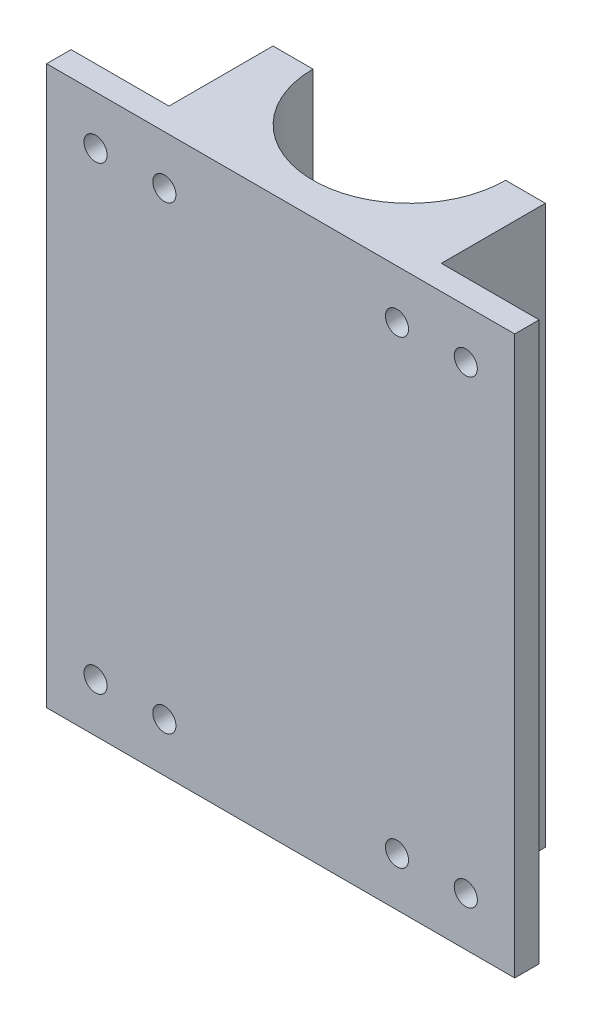
ISO-10303-21;
HEADER;
FILE_DESCRIPTION(('STEP AP214'),'2;1');
FILE_NAME('part.step','',(''),(''),'','','');
FILE_SCHEMA(('AUTOMOTIVE_DESIGN { 1 0 10303 214 1 1 1 1 }'));
ENDSEC;
DATA;
#1=APPLICATION_CONTEXT('core data for automotive mechanical design processes');
#2=APPLICATION_PROTOCOL_DEFINITION('international standard','automotive_design',2000,#1);
#3=PRODUCT_CONTEXT('',#1,'mechanical');
#4=PRODUCT('Part','Part','',(#3));
#5=PRODUCT_RELATED_PRODUCT_CATEGORY('part','',(#4));
#6=PRODUCT_DEFINITION_FORMATION('','',#4);
#7=PRODUCT_DEFINITION_CONTEXT('part definition',#1,'design');
#8=PRODUCT_DEFINITION('design','',#6,#7);
#9=PRODUCT_DEFINITION_SHAPE('','',#8);
#10=(LENGTH_UNIT() NAMED_UNIT(*) SI_UNIT(.MILLI.,.METRE.));
#11=(NAMED_UNIT(*) PLANE_ANGLE_UNIT() SI_UNIT($,.RADIAN.));
#12=(NAMED_UNIT(*) SI_UNIT($,.STERADIAN.) SOLID_ANGLE_UNIT());
#13=UNCERTAINTY_MEASURE_WITH_UNIT(LENGTH_MEASURE(1.E-05),#10,'distance_accuracy_value','');
#14=(GEOMETRIC_REPRESENTATION_CONTEXT(3) GLOBAL_UNCERTAINTY_ASSIGNED_CONTEXT((#13)) GLOBAL_UNIT_ASSIGNED_CONTEXT((#10,
#11,#12)) REPRESENTATION_CONTEXT('',''));
#15=CARTESIAN_POINT('',(0.,0.,0.));
#16=DIRECTION('',(0.,0.,1.));
#17=DIRECTION('',(1.,0.,0.));
#18=AXIS2_PLACEMENT_3D('',#15,#16,#17);
#19=CARTESIAN_POINT('',(0.,72.39,-17.6981702709716));
#20=DIRECTION('',(0.,0.,-1.));
#21=DIRECTION('',(-1.,0.,0.));
#22=AXIS2_PLACEMENT_3D('',#19,#20,#21);
#23=PLANE('',#22);
#24=CARTESIAN_POINT('',(30.5533116,66.04,-17.6981702709716));
#25=DIRECTION('',(0.,0.,-1.));
#26=DIRECTION('',(-1.,0.,0.));
#27=AXIS2_PLACEMENT_3D('',#24,#25,#26);
#28=CIRCLE('',#27,1.5);
#29=CARTESIAN_POINT('',(29.0533116,66.04,-17.6981702709716));
#30=VERTEX_POINT('',#29);
#31=EDGE_CURVE('E188',#30,#30,#28,.T.);
#32=ORIENTED_EDGE('',*,*,#31,.F.);
#33=EDGE_LOOP('',(#32));
#34=FACE_BOUND('',#33,.T.);
#35=CARTESIAN_POINT('',(30.5533116,6.35,-17.6981702709716));
#36=DIRECTION('',(0.,0.,-1.));
#37=DIRECTION('',(-1.,0.,0.));
#38=AXIS2_PLACEMENT_3D('',#35,#36,#37);
#39=CIRCLE('',#38,1.5);
#40=CARTESIAN_POINT('',(29.0533116,6.35,-17.6981702709716));
#41=VERTEX_POINT('',#40);
#42=EDGE_CURVE('E184',#41,#41,#39,.T.);
#43=ORIENTED_EDGE('',*,*,#42,.F.);
#44=EDGE_LOOP('',(#43));
#45=FACE_BOUND('',#44,.T.);
#46=DIRECTION('',(1.,0.,0.));
#47=VECTOR('',#46,1.);
#48=CARTESIAN_POINT('',(0.,0.,-17.6981702709716));
#49=LINE('',#48,#47);
#50=CARTESIAN_POINT('',(24.2033116,0.,-17.6981702709716));
#51=VERTEX_POINT('',#50);
#52=CARTESIAN_POINT('',(36.9033116,0.,-17.6981702709716));
#53=VERTEX_POINT('',#52);
#54=EDGE_CURVE('E137',#51,#53,#49,.T.);
#55=ORIENTED_EDGE('',*,*,#54,.F.);
#56=DIRECTION('',(0.,-1.,0.));
#57=VECTOR('',#56,1.);
#58=CARTESIAN_POINT('',(24.2033116,72.39,-17.6981702709716));
#59=LINE('',#58,#57);
#60=CARTESIAN_POINT('',(24.2033116,72.39,-17.6981702709716));
#61=VERTEX_POINT('',#60);
#62=EDGE_CURVE('E11',#61,#51,#59,.T.);
#63=ORIENTED_EDGE('',*,*,#62,.F.);
#64=DIRECTION('',(1.,0.,0.));
#65=VECTOR('',#64,1.);
#66=CARTESIAN_POINT('',(0.,72.39,-17.6981702709716));
#67=LINE('',#66,#65);
#68=CARTESIAN_POINT('',(36.9033116,72.39,-17.6981702709716));
#69=VERTEX_POINT('',#68);
#70=EDGE_CURVE('E160',#61,#69,#67,.T.);
#71=ORIENTED_EDGE('',*,*,#70,.T.);
#72=DIRECTION('',(0.,-1.,0.));
#73=VECTOR('',#72,1.);
#74=CARTESIAN_POINT('',(36.9033116,72.39,-17.6981702709716));
#75=LINE('',#74,#73);
#76=EDGE_CURVE('E51',#69,#53,#75,.T.);
#77=ORIENTED_EDGE('',*,*,#76,.T.);
#78=EDGE_LOOP('',(#55,#63,#71,#77));
#79=FACE_BOUND('',#78,.T.);
#80=ADVANCED_FACE('F33',(#34,#45,#79),#23,.T.);
#81=CARTESIAN_POINT('',(24.2033116,72.39,0.));
#82=DIRECTION('',(1.,0.,0.));
#83=DIRECTION('',(0.,0.,-1.));
#84=AXIS2_PLACEMENT_3D('',#81,#82,#83);
#85=PLANE('',#84);
#86=DIRECTION('',(0.,0.,1.));
#87=VECTOR('',#86,1.);
#88=CARTESIAN_POINT('',(24.2033116,0.,0.));
#89=LINE('',#88,#87);
#90=CARTESIAN_POINT('',(24.2033116,0.,-31.2047756606383));
#91=VERTEX_POINT('',#90);
#92=EDGE_CURVE('E139',#91,#51,#89,.T.);
#93=ORIENTED_EDGE('',*,*,#92,.F.);
#94=DIRECTION('',(0.,-1.,0.));
#95=VECTOR('',#94,1.);
#96=CARTESIAN_POINT('',(24.2033116,72.39,-31.2047756606383));
#97=LINE('',#96,#95);
#98=CARTESIAN_POINT('',(24.2033116,72.39,-31.2047756606383));
#99=VERTEX_POINT('',#98);
#100=EDGE_CURVE('E42',#99,#91,#97,.T.);
#101=ORIENTED_EDGE('',*,*,#100,.F.);
#102=DIRECTION('',(0.,0.,1.));
#103=VECTOR('',#102,1.);
#104=CARTESIAN_POINT('',(24.2033116,72.39,0.));
#105=LINE('',#104,#103);
#106=EDGE_CURVE('E240',#99,#61,#105,.T.);
#107=ORIENTED_EDGE('',*,*,#106,.T.);
#108=ORIENTED_EDGE('',*,*,#62,.T.);
#109=EDGE_LOOP('',(#93,#101,#107,#108));
#110=FACE_BOUND('',#109,.T.);
#111=ADVANCED_FACE('F270',(#110),#85,.T.);
#112=CARTESIAN_POINT('',(0.,72.39,-31.2047756606383));
#113=DIRECTION('',(0.,0.,1.));
#114=DIRECTION('',(1.,0.,0.));
#115=AXIS2_PLACEMENT_3D('',#112,#113,#114);
#116=PLANE('',#115);
#117=CARTESIAN_POINT('',(21.6233116,66.04,-31.2047756606383));
#118=DIRECTION('',(0.,0.,-1.));
#119=DIRECTION('',(-1.,0.,0.));
#120=AXIS2_PLACEMENT_3D('',#117,#118,#119);
#121=CIRCLE('',#120,1.5);
#122=CARTESIAN_POINT('',(20.1233116,66.04,-31.2047756606383));
#123=VERTEX_POINT('',#122);
#124=EDGE_CURVE('E470',#123,#123,#121,.T.);
#125=ORIENTED_EDGE('',*,*,#124,.F.);
#126=EDGE_LOOP('',(#125));
#127=FACE_BOUND('',#126,.T.);
#128=CARTESIAN_POINT('',(21.6233116,6.35,-31.2047756606383));
#129=DIRECTION('',(0.,0.,-1.));
#130=DIRECTION('',(-1.,0.,0.));
#131=AXIS2_PLACEMENT_3D('',#128,#129,#130);
#132=CIRCLE('',#131,1.5);
#133=CARTESIAN_POINT('',(20.1233116,6.35,-31.2047756606383));
#134=VERTEX_POINT('',#133);
#135=EDGE_CURVE('E204',#134,#134,#132,.T.);
#136=ORIENTED_EDGE('',*,*,#135,.F.);
#137=EDGE_LOOP('',(#136));
#138=FACE_BOUND('',#137,.T.);
#139=DIRECTION('',(-1.,0.,0.));
#140=VECTOR('',#139,1.);
#141=CARTESIAN_POINT('',(0.,0.,-31.2047756606383));
#142=LINE('',#141,#140);
#143=CARTESIAN_POINT('',(18.741964554409,0.,-31.2047756606383));
#144=VERTEX_POINT('',#143);
#145=EDGE_CURVE('E143',#91,#144,#142,.T.);
#146=ORIENTED_EDGE('',*,*,#145,.T.);
#147=DIRECTION('',(0.,-1.,0.));
#148=VECTOR('',#147,1.);
#149=CARTESIAN_POINT('',(18.741964554409,51.39,-31.2047756606383));
#150=LINE('',#149,#148);
#151=CARTESIAN_POINT('',(18.741964554409,51.39,-31.2047756606383));
#152=VERTEX_POINT('',#151);
#153=EDGE_CURVE('E140',#152,#144,#150,.T.);
#154=ORIENTED_EDGE('',*,*,#153,.F.);
#155=DIRECTION('',(-1.,0.,0.));
#156=VECTOR('',#155,1.);
#157=CARTESIAN_POINT('',(19.041964554409,51.39,-31.2047756606383));
#158=LINE('',#157,#156);
#159=CARTESIAN_POINT('',(19.041964554409,51.39,-31.2047756606383));
#160=VERTEX_POINT('',#159);
#161=EDGE_CURVE('E226',#160,#152,#158,.T.);
#162=ORIENTED_EDGE('',*,*,#161,.F.);
#163=DIRECTION('',(0.,-1.,0.));
#164=VECTOR('',#163,1.);
#165=CARTESIAN_POINT('',(19.041964554409,72.39,-31.2047756606383));
#166=LINE('',#165,#164);
#167=CARTESIAN_POINT('',(19.041964554409,72.39,-31.2047756606383));
#168=VERTEX_POINT('',#167);
#169=EDGE_CURVE('E172',#168,#160,#166,.T.);
#170=ORIENTED_EDGE('',*,*,#169,.F.);
#171=DIRECTION('',(-1.,0.,0.));
#172=VECTOR('',#171,1.);
#173=CARTESIAN_POINT('',(0.,72.39,-31.2047756606383));
#174=LINE('',#173,#172);
#175=EDGE_CURVE('E243',#99,#168,#174,.T.);
#176=ORIENTED_EDGE('',*,*,#175,.F.);
#177=ORIENTED_EDGE('',*,*,#100,.T.);
#178=EDGE_LOOP('',(#146,#154,#162,#170,#176,#177));
#179=FACE_BOUND('',#178,.T.);
#180=ADVANCED_FACE('F275',(#127,#138,#179),#116,.F.);
#181=CARTESIAN_POINT('',(6.54196455440903,72.39,-31.2047756606383));
#182=DIRECTION('',(0.,-1.,0.));
#183=DIRECTION('',(0.,0.,-1.));
#184=AXIS2_PLACEMENT_3D('',#181,#182,#183);
#185=CYLINDRICAL_SURFACE('',#184,12.5);
#186=CARTESIAN_POINT('',(6.54196455440903,51.39,-31.2047756606383));
#187=DIRECTION('',(0.,1.,0.));
#188=DIRECTION('',(0.,0.,1.));
#189=AXIS2_PLACEMENT_3D('',#186,#187,#188);
#190=CIRCLE('',#189,12.5);
#191=CARTESIAN_POINT('',(-5.95803544559097,51.39,-31.2047756606383));
#192=VERTEX_POINT('',#191);
#193=EDGE_CURVE('E229',#192,#160,#190,.T.);
#194=ORIENTED_EDGE('',*,*,#193,.F.);
#195=DIRECTION('',(0.,-1.,0.));
#196=VECTOR('',#195,1.);
#197=CARTESIAN_POINT('',(-5.95803544559097,72.39,-31.2047756606383));
#198=LINE('',#197,#196);
#199=CARTESIAN_POINT('',(-5.95803544559097,72.39,-31.2047756606383));
#200=VERTEX_POINT('',#199);
#201=EDGE_CURVE('E169',#200,#192,#198,.T.);
#202=ORIENTED_EDGE('',*,*,#201,.F.);
#203=CARTESIAN_POINT('',(6.54196455440903,72.39,-31.2047756606383));
#204=DIRECTION('',(0.,1.,0.));
#205=DIRECTION('',(0.,0.,1.));
#206=AXIS2_PLACEMENT_3D('',#203,#204,#205);
#207=CIRCLE('',#206,12.5);
#208=EDGE_CURVE('E245',#200,#168,#207,.T.);
#209=ORIENTED_EDGE('',*,*,#208,.T.);
#210=ORIENTED_EDGE('',*,*,#169,.T.);
#211=EDGE_LOOP('',(#194,#202,#209,#210));
#212=FACE_BOUND('',#211,.T.);
#213=ADVANCED_FACE('F292',(#212),#185,.F.);
#214=CARTESIAN_POINT('',(0.,72.39,-31.2047756606383));
#215=DIRECTION('',(0.,0.,1.));
#216=DIRECTION('',(1.,0.,0.));
#217=AXIS2_PLACEMENT_3D('',#214,#215,#216);
#218=PLANE('',#217);
#219=CARTESIAN_POINT('',(-8.5666884,6.35,-31.2047756606383));
#220=DIRECTION('',(0.,0.,-1.));
#221=DIRECTION('',(-1.,0.,0.));
#222=AXIS2_PLACEMENT_3D('',#219,#220,#221);
#223=CIRCLE('',#222,1.5);
#224=CARTESIAN_POINT('',(-10.0666884,6.35,-31.2047756606383));
#225=VERTEX_POINT('',#224);
#226=EDGE_CURVE('E194',#225,#225,#223,.T.);
#227=ORIENTED_EDGE('',*,*,#226,.F.);
#228=EDGE_LOOP('',(#227));
#229=FACE_BOUND('',#228,.T.);
#230=CARTESIAN_POINT('',(-8.5666884,66.04,-31.2047756606383));
#231=DIRECTION('',(0.,0.,-1.));
#232=DIRECTION('',(-1.,0.,0.));
#233=AXIS2_PLACEMENT_3D('',#230,#231,#232);
#234=CIRCLE('',#233,1.5);
#235=CARTESIAN_POINT('',(-10.0666884,66.04,-31.2047756606383));
#236=VERTEX_POINT('',#235);
#237=EDGE_CURVE('E191',#236,#236,#234,.T.);
#238=ORIENTED_EDGE('',*,*,#237,.F.);
#239=EDGE_LOOP('',(#238));
#240=FACE_BOUND('',#239,.T.);
#241=DIRECTION('',(-1.,0.,0.));
#242=VECTOR('',#241,1.);
#243=CARTESIAN_POINT('',(0.,0.,-31.2047756606383));
#244=LINE('',#243,#242);
#245=CARTESIAN_POINT('',(-5.65803544559097,0.,-31.2047756606383));
#246=VERTEX_POINT('',#245);
#247=CARTESIAN_POINT('',(-11.1466884,0.,-31.2047756606383));
#248=VERTEX_POINT('',#247);
#249=EDGE_CURVE('E146',#246,#248,#244,.T.);
#250=ORIENTED_EDGE('',*,*,#249,.T.);
#251=DIRECTION('',(0.,-1.,0.));
#252=VECTOR('',#251,1.);
#253=CARTESIAN_POINT('',(-11.1466884,72.39,-31.2047756606383));
#254=LINE('',#253,#252);
#255=CARTESIAN_POINT('',(-11.1466884,72.39,-31.2047756606383));
#256=VERTEX_POINT('',#255);
#257=EDGE_CURVE('E166',#256,#248,#254,.T.);
#258=ORIENTED_EDGE('',*,*,#257,.F.);
#259=DIRECTION('',(-1.,0.,0.));
#260=VECTOR('',#259,1.);
#261=CARTESIAN_POINT('',(0.,72.39,-31.2047756606383));
#262=LINE('',#261,#260);
#263=EDGE_CURVE('E248',#200,#256,#262,.T.);
#264=ORIENTED_EDGE('',*,*,#263,.F.);
#265=ORIENTED_EDGE('',*,*,#201,.T.);
#266=DIRECTION('',(1.,0.,0.));
#267=VECTOR('',#266,1.);
#268=CARTESIAN_POINT('',(-5.95803544559097,51.39,-31.2047756606383));
#269=LINE('',#268,#267);
#270=CARTESIAN_POINT('',(-5.65803544559097,51.39,-31.2047756606383));
#271=VERTEX_POINT('',#270);
#272=EDGE_CURVE('E220',#192,#271,#269,.T.);
#273=ORIENTED_EDGE('',*,*,#272,.T.);
#274=DIRECTION('',(0.,-1.,0.));
#275=VECTOR('',#274,1.);
#276=CARTESIAN_POINT('',(-5.65803544559097,51.39,-31.2047756606383));
#277=LINE('',#276,#275);
#278=EDGE_CURVE('E232',#271,#246,#277,.T.);
#279=ORIENTED_EDGE('',*,*,#278,.T.);
#280=EDGE_LOOP('',(#250,#258,#264,#265,#273,#279));
#281=FACE_BOUND('',#280,.T.);
#282=ADVANCED_FACE('F296',(#229,#240,#281),#218,.F.);
#283=CARTESIAN_POINT('',(-11.1466884,72.39,0.));
#284=DIRECTION('',(1.,0.,0.));
#285=DIRECTION('',(0.,0.,-1.));
#286=AXIS2_PLACEMENT_3D('',#283,#284,#285);
#287=PLANE('',#286);
#288=DIRECTION('',(0.,0.,1.));
#289=VECTOR('',#288,1.);
#290=CARTESIAN_POINT('',(-11.1466884,0.,0.));
#291=LINE('',#290,#289);
#292=CARTESIAN_POINT('',(-11.1466884,0.,-17.6981702709716));
#293=VERTEX_POINT('',#292);
#294=EDGE_CURVE('E148',#248,#293,#291,.T.);
#295=ORIENTED_EDGE('',*,*,#294,.T.);
#296=DIRECTION('',(0.,-1.,0.));
#297=VECTOR('',#296,1.);
#298=CARTESIAN_POINT('',(-11.1466884,72.39,-17.6981702709716));
#299=LINE('',#298,#297);
#300=CARTESIAN_POINT('',(-11.1466884,72.39,-17.6981702709716));
#301=VERTEX_POINT('',#300);
#302=EDGE_CURVE('E164',#301,#293,#299,.T.);
#303=ORIENTED_EDGE('',*,*,#302,.F.);
#304=DIRECTION('',(0.,0.,1.));
#305=VECTOR('',#304,1.);
#306=CARTESIAN_POINT('',(-11.1466884,72.39,0.));
#307=LINE('',#306,#305);
#308=EDGE_CURVE('E250',#256,#301,#307,.T.);
#309=ORIENTED_EDGE('',*,*,#308,.F.);
#310=ORIENTED_EDGE('',*,*,#257,.T.);
#311=EDGE_LOOP('',(#295,#303,#309,#310));
#312=FACE_BOUND('',#311,.T.);
#313=ADVANCED_FACE('F299',(#312),#287,.F.);
#314=CARTESIAN_POINT('',(0.,72.39,-17.6981702709716));
#315=DIRECTION('',(0.,0.,-1.));
#316=DIRECTION('',(-1.,0.,0.));
#317=AXIS2_PLACEMENT_3D('',#314,#315,#316);
#318=PLANE('',#317);
#319=CARTESIAN_POINT('',(-17.4985284,6.35,-17.6981702709716));
#320=DIRECTION('',(0.,0.,-1.));
#321=DIRECTION('',(-1.,0.,0.));
#322=AXIS2_PLACEMENT_3D('',#319,#320,#321);
#323=CIRCLE('',#322,1.5);
#324=CARTESIAN_POINT('',(-18.9985284,6.35,-17.6981702709716));
#325=VERTEX_POINT('',#324);
#326=EDGE_CURVE('E180',#325,#325,#323,.T.);
#327=ORIENTED_EDGE('',*,*,#326,.F.);
#328=EDGE_LOOP('',(#327));
#329=FACE_BOUND('',#328,.T.);
#330=CARTESIAN_POINT('',(-17.4985284,66.04,-17.6981702709716));
#331=DIRECTION('',(0.,0.,-1.));
#332=DIRECTION('',(-1.,0.,0.));
#333=AXIS2_PLACEMENT_3D('',#330,#331,#332);
#334=CIRCLE('',#333,1.5);
#335=CARTESIAN_POINT('',(-18.9985284,66.04,-17.6981702709716));
#336=VERTEX_POINT('',#335);
#337=EDGE_CURVE('E179',#336,#336,#334,.T.);
#338=ORIENTED_EDGE('',*,*,#337,.F.);
#339=EDGE_LOOP('',(#338));
#340=FACE_BOUND('',#339,.T.);
#341=DIRECTION('',(1.,0.,0.));
#342=VECTOR('',#341,1.);
#343=CARTESIAN_POINT('',(0.,0.,-17.6981702709716));
#344=LINE('',#343,#342);
#345=CARTESIAN_POINT('',(-23.8485284,0.,-17.6981702709716));
#346=VERTEX_POINT('',#345);
#347=EDGE_CURVE('E151',#346,#293,#344,.T.);
#348=ORIENTED_EDGE('',*,*,#347,.F.);
#349=DIRECTION('',(0.,-1.,0.));
#350=VECTOR('',#349,1.);
#351=CARTESIAN_POINT('',(-23.8485284,72.39,-17.6981702709716));
#352=LINE('',#351,#350);
#353=CARTESIAN_POINT('',(-23.8485284,72.39,-17.6981702709716));
#354=VERTEX_POINT('',#353);
#355=EDGE_CURVE('E129',#354,#346,#352,.T.);
#356=ORIENTED_EDGE('',*,*,#355,.F.);
#357=DIRECTION('',(1.,0.,0.));
#358=VECTOR('',#357,1.);
#359=CARTESIAN_POINT('',(0.,72.39,-17.6981702709716));
#360=LINE('',#359,#358);
#361=EDGE_CURVE('E119',#354,#301,#360,.T.);
#362=ORIENTED_EDGE('',*,*,#361,.T.);
#363=ORIENTED_EDGE('',*,*,#302,.T.);
#364=EDGE_LOOP('',(#348,#356,#362,#363));
#365=FACE_BOUND('',#364,.T.);
#366=ADVANCED_FACE('F253',(#329,#340,#365),#318,.T.);
#367=CARTESIAN_POINT('',(-23.8485284,72.39,0.));
#368=DIRECTION('',(1.,0.,0.));
#369=DIRECTION('',(0.,0.,-1.));
#370=AXIS2_PLACEMENT_3D('',#367,#368,#369);
#371=PLANE('',#370);
#372=DIRECTION('',(0.,0.,1.));
#373=VECTOR('',#372,1.);
#374=CARTESIAN_POINT('',(-23.8485284,0.,0.));
#375=LINE('',#374,#373);
#376=CARTESIAN_POINT('',(-23.8485284,0.,-14.5231702709716));
#377=VERTEX_POINT('',#376);
#378=EDGE_CURVE('E126',#346,#377,#375,.T.);
#379=ORIENTED_EDGE('',*,*,#378,.T.);
#380=DIRECTION('',(0.,-1.,0.));
#381=VECTOR('',#380,1.);
#382=CARTESIAN_POINT('',(-23.8485284,72.39,-14.5231702709716));
#383=LINE('',#382,#381);
#384=CARTESIAN_POINT('',(-23.8485284,72.39,-14.5231702709716));
#385=VERTEX_POINT('',#384);
#386=EDGE_CURVE('E123',#385,#377,#383,.T.);
#387=ORIENTED_EDGE('',*,*,#386,.F.);
#388=DIRECTION('',(0.,0.,1.));
#389=VECTOR('',#388,1.);
#390=CARTESIAN_POINT('',(-23.8485284,72.39,0.));
#391=LINE('',#390,#389);
#392=EDGE_CURVE('E112',#354,#385,#391,.T.);
#393=ORIENTED_EDGE('',*,*,#392,.F.);
#394=ORIENTED_EDGE('',*,*,#355,.T.);
#395=EDGE_LOOP('',(#379,#387,#393,#394));
#396=FACE_BOUND('',#395,.T.);
#397=ADVANCED_FACE('F124',(#396),#371,.F.);
#398=CARTESIAN_POINT('',(0.,72.39,-14.5231702709716));
#399=DIRECTION('',(0.,0.,-1.));
#400=DIRECTION('',(-1.,0.,0.));
#401=AXIS2_PLACEMENT_3D('',#398,#399,#400);
#402=PLANE('',#401);
#403=CARTESIAN_POINT('',(21.6233116,66.04,-14.5231702709716));
#404=DIRECTION('',(0.,0.,-1.));
#405=DIRECTION('',(-1.,0.,0.));
#406=AXIS2_PLACEMENT_3D('',#403,#404,#405);
#407=CIRCLE('',#406,1.5);
#408=CARTESIAN_POINT('',(20.1233116,66.04,-14.5231702709716));
#409=VERTEX_POINT('',#408);
#410=EDGE_CURVE('E473',#409,#409,#407,.T.);
#411=ORIENTED_EDGE('',*,*,#410,.T.);
#412=EDGE_LOOP('',(#411));
#413=FACE_BOUND('',#412,.T.);
#414=CARTESIAN_POINT('',(21.6233116,6.35,-14.5231702709716));
#415=DIRECTION('',(0.,0.,-1.));
#416=DIRECTION('',(-1.,0.,0.));
#417=AXIS2_PLACEMENT_3D('',#414,#415,#416);
#418=CIRCLE('',#417,1.5);
#419=CARTESIAN_POINT('',(20.1233116,6.35,-14.5231702709716));
#420=VERTEX_POINT('',#419);
#421=EDGE_CURVE('E36',#420,#420,#418,.T.);
#422=ORIENTED_EDGE('',*,*,#421,.T.);
#423=EDGE_LOOP('',(#422));
#424=FACE_BOUND('',#423,.T.);
#425=CARTESIAN_POINT('',(-8.5666884,6.35,-14.5231702709716));
#426=DIRECTION('',(0.,0.,-1.));
#427=DIRECTION('',(-1.,0.,0.));
#428=AXIS2_PLACEMENT_3D('',#425,#426,#427);
#429=CIRCLE('',#428,1.5);
#430=CARTESIAN_POINT('',(-10.0666884,6.35,-14.5231702709716));
#431=VERTEX_POINT('',#430);
#432=EDGE_CURVE('E192',#431,#431,#429,.T.);
#433=ORIENTED_EDGE('',*,*,#432,.T.);
#434=EDGE_LOOP('',(#433));
#435=FACE_BOUND('',#434,.T.);
#436=CARTESIAN_POINT('',(-8.5666884,66.04,-14.5231702709716));
#437=DIRECTION('',(0.,0.,-1.));
#438=DIRECTION('',(-1.,0.,0.));
#439=AXIS2_PLACEMENT_3D('',#436,#437,#438);
#440=CIRCLE('',#439,1.5);
#441=CARTESIAN_POINT('',(-10.0666884,66.04,-14.5231702709716));
#442=VERTEX_POINT('',#441);
#443=EDGE_CURVE('E189',#442,#442,#440,.T.);
#444=ORIENTED_EDGE('',*,*,#443,.T.);
#445=EDGE_LOOP('',(#444));
#446=FACE_BOUND('',#445,.T.);
#447=CARTESIAN_POINT('',(30.5533116,66.04,-14.5231702709716));
#448=DIRECTION('',(0.,0.,-1.));
#449=DIRECTION('',(-1.,0.,0.));
#450=AXIS2_PLACEMENT_3D('',#447,#448,#449);
#451=CIRCLE('',#450,1.5);
#452=CARTESIAN_POINT('',(29.0533116,66.04,-14.5231702709716));
#453=VERTEX_POINT('',#452);
#454=EDGE_CURVE('E185',#453,#453,#451,.T.);
#455=ORIENTED_EDGE('',*,*,#454,.T.);
#456=EDGE_LOOP('',(#455));
#457=FACE_BOUND('',#456,.T.);
#458=CARTESIAN_POINT('',(30.5533116,6.35,-14.5231702709716));
#459=DIRECTION('',(0.,0.,-1.));
#460=DIRECTION('',(-1.,0.,0.));
#461=AXIS2_PLACEMENT_3D('',#458,#459,#460);
#462=CIRCLE('',#461,1.5);
#463=CARTESIAN_POINT('',(29.0533116,6.35,-14.5231702709716));
#464=VERTEX_POINT('',#463);
#465=EDGE_CURVE('E181',#464,#464,#462,.T.);
#466=ORIENTED_EDGE('',*,*,#465,.T.);
#467=EDGE_LOOP('',(#466));
#468=FACE_BOUND('',#467,.T.);
#469=CARTESIAN_POINT('',(-17.4985284,6.35,-14.5231702709716));
#470=DIRECTION('',(0.,0.,-1.));
#471=DIRECTION('',(-1.,0.,0.));
#472=AXIS2_PLACEMENT_3D('',#469,#470,#471);
#473=CIRCLE('',#472,1.5);
#474=CARTESIAN_POINT('',(-18.9985284,6.35,-14.5231702709716));
#475=VERTEX_POINT('',#474);
#476=EDGE_CURVE('E176',#475,#475,#473,.T.);
#477=ORIENTED_EDGE('',*,*,#476,.T.);
#478=EDGE_LOOP('',(#477));
#479=FACE_BOUND('',#478,.T.);
#480=CARTESIAN_POINT('',(-17.4985284,66.04,-14.5231702709716));
#481=DIRECTION('',(0.,0.,-1.));
#482=DIRECTION('',(-1.,0.,0.));
#483=AXIS2_PLACEMENT_3D('',#480,#481,#482);
#484=CIRCLE('',#483,1.5);
#485=CARTESIAN_POINT('',(-18.9985284,66.04,-14.5231702709716));
#486=VERTEX_POINT('',#485);
#487=EDGE_CURVE('E216',#486,#486,#484,.T.);
#488=ORIENTED_EDGE('',*,*,#487,.T.);
#489=EDGE_LOOP('',(#488));
#490=FACE_BOUND('',#489,.T.);
#491=DIRECTION('',(1.,0.,0.));
#492=VECTOR('',#491,1.);
#493=CARTESIAN_POINT('',(0.,0.,-14.5231702709716));
#494=LINE('',#493,#492);
#495=CARTESIAN_POINT('',(36.9033116,0.,-14.5231702709716));
#496=VERTEX_POINT('',#495);
#497=EDGE_CURVE('E155',#377,#496,#494,.T.);
#498=ORIENTED_EDGE('',*,*,#497,.T.);
#499=DIRECTION('',(0.,-1.,0.));
#500=VECTOR('',#499,1.);
#501=CARTESIAN_POINT('',(36.9033116,72.39,-14.5231702709716));
#502=LINE('',#501,#500);
#503=CARTESIAN_POINT('',(36.9033116,72.39,-14.5231702709716));
#504=VERTEX_POINT('',#503);
#505=EDGE_CURVE('E78',#504,#496,#502,.T.);
#506=ORIENTED_EDGE('',*,*,#505,.F.);
#507=DIRECTION('',(1.,0.,0.));
#508=VECTOR('',#507,1.);
#509=CARTESIAN_POINT('',(0.,72.39,-14.5231702709716));
#510=LINE('',#509,#508);
#511=EDGE_CURVE('E117',#385,#504,#510,.T.);
#512=ORIENTED_EDGE('',*,*,#511,.F.);
#513=ORIENTED_EDGE('',*,*,#386,.T.);
#514=EDGE_LOOP('',(#498,#506,#512,#513));
#515=FACE_BOUND('',#514,.T.);
#516=ADVANCED_FACE('F131',(#413,#424,#435,#446,#457,#468,#479,#490,#515),#402,.F.);
#517=CARTESIAN_POINT('',(36.9033116,72.39,0.));
#518=DIRECTION('',(1.,0.,0.));
#519=DIRECTION('',(0.,0.,-1.));
#520=AXIS2_PLACEMENT_3D('',#517,#518,#519);
#521=PLANE('',#520);
#522=DIRECTION('',(0.,0.,1.));
#523=VECTOR('',#522,1.);
#524=CARTESIAN_POINT('',(36.9033116,0.,0.));
#525=LINE('',#524,#523);
#526=EDGE_CURVE('E157',#53,#496,#525,.T.);
#527=ORIENTED_EDGE('',*,*,#526,.F.);
#528=ORIENTED_EDGE('',*,*,#76,.F.);
#529=DIRECTION('',(0.,0.,1.));
#530=VECTOR('',#529,1.);
#531=CARTESIAN_POINT('',(36.9033116,72.39,0.));
#532=LINE('',#531,#530);
#533=EDGE_CURVE('E132',#69,#504,#532,.T.);
#534=ORIENTED_EDGE('',*,*,#533,.T.);
#535=ORIENTED_EDGE('',*,*,#505,.T.);
#536=EDGE_LOOP('',(#527,#528,#534,#535));
#537=FACE_BOUND('',#536,.T.);
#538=ADVANCED_FACE('F258',(#537),#521,.T.);
#539=CARTESIAN_POINT('',(0.,72.39,0.));
#540=DIRECTION('',(0.,1.,0.));
#541=DIRECTION('',(0.,0.,1.));
#542=AXIS2_PLACEMENT_3D('',#539,#540,#541);
#543=PLANE('',#542);
#544=ORIENTED_EDGE('',*,*,#70,.F.);
#545=ORIENTED_EDGE('',*,*,#106,.F.);
#546=ORIENTED_EDGE('',*,*,#175,.T.);
#547=ORIENTED_EDGE('',*,*,#208,.F.);
#548=ORIENTED_EDGE('',*,*,#263,.T.);
#549=ORIENTED_EDGE('',*,*,#308,.T.);
#550=ORIENTED_EDGE('',*,*,#361,.F.);
#551=ORIENTED_EDGE('',*,*,#392,.T.);
#552=ORIENTED_EDGE('',*,*,#511,.T.);
#553=ORIENTED_EDGE('',*,*,#533,.F.);
#554=EDGE_LOOP('',(#544,#545,#546,#547,#548,#549,#550,#551,#552,#553));
#555=FACE_BOUND('',#554,.T.);
#556=ADVANCED_FACE('F114',(#555),#543,.T.);
#557=CARTESIAN_POINT('',(0.,0.,0.));
#558=DIRECTION('',(0.,1.,0.));
#559=DIRECTION('',(0.,0.,1.));
#560=AXIS2_PLACEMENT_3D('',#557,#558,#559);
#561=PLANE('',#560);
#562=ORIENTED_EDGE('',*,*,#54,.T.);
#563=ORIENTED_EDGE('',*,*,#526,.T.);
#564=ORIENTED_EDGE('',*,*,#497,.F.);
#565=ORIENTED_EDGE('',*,*,#378,.F.);
#566=ORIENTED_EDGE('',*,*,#347,.T.);
#567=ORIENTED_EDGE('',*,*,#294,.F.);
#568=ORIENTED_EDGE('',*,*,#249,.F.);
#569=CARTESIAN_POINT('',(6.54196455440903,0.,-31.2047756606383));
#570=DIRECTION('',(0.,1.,0.));
#571=DIRECTION('',(0.,0.,1.));
#572=AXIS2_PLACEMENT_3D('',#569,#570,#571);
#573=CIRCLE('',#572,12.2);
#574=EDGE_CURVE('E219',#246,#144,#573,.T.);
#575=ORIENTED_EDGE('',*,*,#574,.T.);
#576=ORIENTED_EDGE('',*,*,#145,.F.);
#577=ORIENTED_EDGE('',*,*,#92,.T.);
#578=EDGE_LOOP('',(#562,#563,#564,#565,#566,#567,#568,#575,#576,#577));
#579=FACE_BOUND('',#578,.T.);
#580=ADVANCED_FACE('F256',(#579),#561,.F.);
#581=CARTESIAN_POINT('',(6.54196455440903,51.39,-31.2047756606383));
#582=DIRECTION('',(0.,-1.,0.));
#583=DIRECTION('',(0.,0.,-1.));
#584=AXIS2_PLACEMENT_3D('',#581,#582,#583);
#585=CYLINDRICAL_SURFACE('',#584,12.2);
#586=ORIENTED_EDGE('',*,*,#574,.F.);
#587=ORIENTED_EDGE('',*,*,#278,.F.);
#588=CARTESIAN_POINT('',(6.54196455440903,51.39,-31.2047756606383));
#589=DIRECTION('',(0.,1.,0.));
#590=DIRECTION('',(0.,0.,1.));
#591=AXIS2_PLACEMENT_3D('',#588,#589,#590);
#592=CIRCLE('',#591,12.2);
#593=EDGE_CURVE('E223',#271,#152,#592,.T.);
#594=ORIENTED_EDGE('',*,*,#593,.T.);
#595=ORIENTED_EDGE('',*,*,#153,.T.);
#596=EDGE_LOOP('',(#586,#587,#594,#595));
#597=FACE_BOUND('',#596,.T.);
#598=ADVANCED_FACE('F308',(#597),#585,.F.);
#599=CARTESIAN_POINT('',(6.54196455440903,51.39,-31.2047756606383));
#600=DIRECTION('',(0.,1.,0.));
#601=DIRECTION('',(0.,0.,1.));
#602=AXIS2_PLACEMENT_3D('',#599,#600,#601);
#603=PLANE('',#602);
#604=ORIENTED_EDGE('',*,*,#272,.F.);
#605=ORIENTED_EDGE('',*,*,#193,.T.);
#606=ORIENTED_EDGE('',*,*,#161,.T.);
#607=ORIENTED_EDGE('',*,*,#593,.F.);
#608=EDGE_LOOP('',(#604,#605,#606,#607));
#609=FACE_BOUND('',#608,.T.);
#610=ADVANCED_FACE('F315',(#609),#603,.T.);
#611=CARTESIAN_POINT('',(-17.4985284,66.04,-17.6981702709716));
#612=DIRECTION('',(0.,0.,-1.));
#613=DIRECTION('',(-1.,0.,0.));
#614=AXIS2_PLACEMENT_3D('',#611,#612,#613);
#615=CYLINDRICAL_SURFACE('',#614,1.5);
#616=ORIENTED_EDGE('',*,*,#337,.T.);
#617=EDGE_LOOP('',(#616));
#618=FACE_BOUND('',#617,.T.);
#619=ORIENTED_EDGE('',*,*,#487,.F.);
#620=EDGE_LOOP('',(#619));
#621=FACE_BOUND('',#620,.T.);
#622=ADVANCED_FACE('F317',(#618,#621),#615,.F.);
#623=CARTESIAN_POINT('',(-17.4985284,6.35,-17.6981702709716));
#624=DIRECTION('',(0.,0.,-1.));
#625=DIRECTION('',(-1.,0.,0.));
#626=AXIS2_PLACEMENT_3D('',#623,#624,#625);
#627=CYLINDRICAL_SURFACE('',#626,1.5);
#628=ORIENTED_EDGE('',*,*,#326,.T.);
#629=EDGE_LOOP('',(#628));
#630=FACE_BOUND('',#629,.T.);
#631=ORIENTED_EDGE('',*,*,#476,.F.);
#632=EDGE_LOOP('',(#631));
#633=FACE_BOUND('',#632,.T.);
#634=ADVANCED_FACE('F323',(#630,#633),#627,.F.);
#635=CARTESIAN_POINT('',(30.5533116,6.35,-17.6981702709716));
#636=DIRECTION('',(0.,0.,-1.));
#637=DIRECTION('',(-1.,0.,0.));
#638=AXIS2_PLACEMENT_3D('',#635,#636,#637);
#639=CYLINDRICAL_SURFACE('',#638,1.5);
#640=ORIENTED_EDGE('',*,*,#42,.T.);
#641=EDGE_LOOP('',(#640));
#642=FACE_BOUND('',#641,.T.);
#643=ORIENTED_EDGE('',*,*,#465,.F.);
#644=EDGE_LOOP('',(#643));
#645=FACE_BOUND('',#644,.T.);
#646=ADVANCED_FACE('F376',(#642,#645),#639,.F.);
#647=CARTESIAN_POINT('',(30.5533116,66.04,-17.6981702709716));
#648=DIRECTION('',(0.,0.,-1.));
#649=DIRECTION('',(-1.,0.,0.));
#650=AXIS2_PLACEMENT_3D('',#647,#648,#649);
#651=CYLINDRICAL_SURFACE('',#650,1.5);
#652=ORIENTED_EDGE('',*,*,#31,.T.);
#653=EDGE_LOOP('',(#652));
#654=FACE_BOUND('',#653,.T.);
#655=ORIENTED_EDGE('',*,*,#454,.F.);
#656=EDGE_LOOP('',(#655));
#657=FACE_BOUND('',#656,.T.);
#658=ADVANCED_FACE('F385',(#654,#657),#651,.F.);
#659=CARTESIAN_POINT('',(-8.5666884,66.04,-31.2047756606383));
#660=DIRECTION('',(0.,0.,-1.));
#661=DIRECTION('',(-1.,0.,0.));
#662=AXIS2_PLACEMENT_3D('',#659,#660,#661);
#663=CYLINDRICAL_SURFACE('',#662,1.5);
#664=ORIENTED_EDGE('',*,*,#237,.T.);
#665=EDGE_LOOP('',(#664));
#666=FACE_BOUND('',#665,.T.);
#667=ORIENTED_EDGE('',*,*,#443,.F.);
#668=EDGE_LOOP('',(#667));
#669=FACE_BOUND('',#668,.T.);
#670=ADVANCED_FACE('F395',(#666,#669),#663,.F.);
#671=CARTESIAN_POINT('',(-8.5666884,6.35,-31.2047756606383));
#672=DIRECTION('',(0.,0.,-1.));
#673=DIRECTION('',(-1.,0.,0.));
#674=AXIS2_PLACEMENT_3D('',#671,#672,#673);
#675=CYLINDRICAL_SURFACE('',#674,1.5);
#676=ORIENTED_EDGE('',*,*,#226,.T.);
#677=EDGE_LOOP('',(#676));
#678=FACE_BOUND('',#677,.T.);
#679=ORIENTED_EDGE('',*,*,#432,.F.);
#680=EDGE_LOOP('',(#679));
#681=FACE_BOUND('',#680,.T.);
#682=ADVANCED_FACE('F434',(#678,#681),#675,.F.);
#683=CARTESIAN_POINT('',(21.6233116,6.35,-31.2047756606383));
#684=DIRECTION('',(0.,0.,-1.));
#685=DIRECTION('',(-1.,0.,0.));
#686=AXIS2_PLACEMENT_3D('',#683,#684,#685);
#687=CYLINDRICAL_SURFACE('',#686,1.5);
#688=ORIENTED_EDGE('',*,*,#135,.T.);
#689=EDGE_LOOP('',(#688));
#690=FACE_BOUND('',#689,.T.);
#691=ORIENTED_EDGE('',*,*,#421,.F.);
#692=EDGE_LOOP('',(#691));
#693=FACE_BOUND('',#692,.T.);
#694=ADVANCED_FACE('F444',(#690,#693),#687,.F.);
#695=CARTESIAN_POINT('',(21.6233116,66.04,-31.2047756606383));
#696=DIRECTION('',(0.,0.,-1.));
#697=DIRECTION('',(-1.,0.,0.));
#698=AXIS2_PLACEMENT_3D('',#695,#696,#697);
#699=CYLINDRICAL_SURFACE('',#698,1.5);
#700=ORIENTED_EDGE('',*,*,#124,.T.);
#701=EDGE_LOOP('',(#700));
#702=FACE_BOUND('',#701,.T.);
#703=ORIENTED_EDGE('',*,*,#410,.F.);
#704=EDGE_LOOP('',(#703));
#705=FACE_BOUND('',#704,.T.);
#706=ADVANCED_FACE('F453',(#702,#705),#699,.F.);
#707=CLOSED_SHELL('',(#80,#111,#180,#213,#282,#313,#366,#397,#516,#538,#556,#580,#598,#610,#622,
#634,#646,#658,#670,#682,#694,#706));
#708=MANIFOLD_SOLID_BREP('B2',#707);
#709=ADVANCED_BREP_SHAPE_REPRESENTATION('',(#18,#708),#14);
#710=SHAPE_DEFINITION_REPRESENTATION(#9,#709);
ENDSEC;
END-ISO-10303-21;
